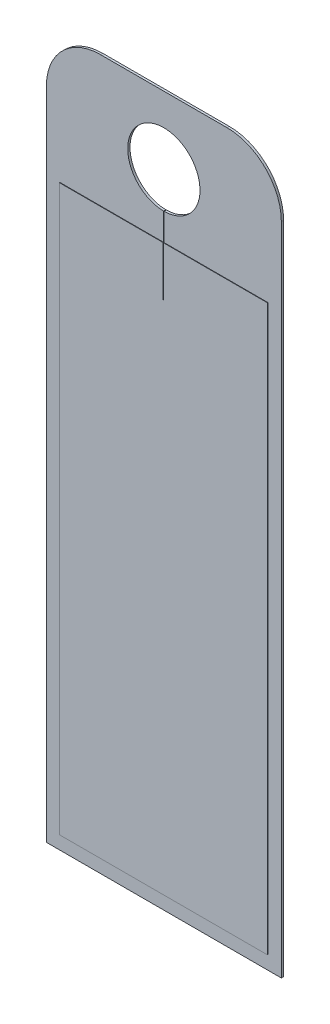
ISO-10303-21;
HEADER;
FILE_DESCRIPTION(('STEP AP214'),'2;1');
FILE_NAME('part.step','',(''),(''),'','','');
FILE_SCHEMA(('AUTOMOTIVE_DESIGN { 1 0 10303 214 1 1 1 1 }'));
ENDSEC;
DATA;
#1=APPLICATION_CONTEXT('core data for automotive mechanical design processes');
#2=APPLICATION_PROTOCOL_DEFINITION('international standard','automotive_design',2000,#1);
#3=PRODUCT_CONTEXT('',#1,'mechanical');
#4=PRODUCT('Part','Part','',(#3));
#5=PRODUCT_RELATED_PRODUCT_CATEGORY('part','',(#4));
#6=PRODUCT_DEFINITION_FORMATION('','',#4);
#7=PRODUCT_DEFINITION_CONTEXT('part definition',#1,'design');
#8=PRODUCT_DEFINITION('design','',#6,#7);
#9=PRODUCT_DEFINITION_SHAPE('','',#8);
#10=(LENGTH_UNIT() NAMED_UNIT(*) SI_UNIT(.MILLI.,.METRE.));
#11=(NAMED_UNIT(*) PLANE_ANGLE_UNIT() SI_UNIT($,.RADIAN.));
#12=(NAMED_UNIT(*) SI_UNIT($,.STERADIAN.) SOLID_ANGLE_UNIT());
#13=UNCERTAINTY_MEASURE_WITH_UNIT(LENGTH_MEASURE(1.E-05),#10,'distance_accuracy_value','');
#14=(GEOMETRIC_REPRESENTATION_CONTEXT(3) GLOBAL_UNCERTAINTY_ASSIGNED_CONTEXT((#13)) GLOBAL_UNIT_ASSIGNED_CONTEXT((#10,
#11,#12)) REPRESENTATION_CONTEXT('',''));
#15=CARTESIAN_POINT('',(0.,0.,0.));
#16=DIRECTION('',(0.,0.,1.));
#17=DIRECTION('',(1.,0.,0.));
#18=AXIS2_PLACEMENT_3D('',#15,#16,#17);
#19=CARTESIAN_POINT('',(-23.,-14.,-133.395345264014));
#20=DIRECTION('',(0.,1.,0.));
#21=DIRECTION('',(-1.,0.,0.));
#22=AXIS2_PLACEMENT_3D('',#19,#20,#21);
#23=PLANE('',#22);
#24=DIRECTION('',(0.,0.,1.));
#25=VECTOR('',#24,1.);
#26=CARTESIAN_POINT('',(-0.0500000000000014,-14.,-133.395345264014));
#27=LINE('',#26,#25);
#28=CARTESIAN_POINT('',(-0.0499999999999982,-14.,-0.099999999999989));
#29=VERTEX_POINT('',#28);
#30=CARTESIAN_POINT('',(-0.0499999999999976,-14.,0.));
#31=VERTEX_POINT('',#30);
#32=EDGE_CURVE('E267',#29,#31,#27,.T.);
#33=ORIENTED_EDGE('',*,*,#32,.F.);
#34=DIRECTION('',(1.,0.,0.));
#35=VECTOR('',#34,1.);
#36=CARTESIAN_POINT('',(-23.,-14.,-0.099999999999989));
#37=LINE('',#36,#35);
#38=CARTESIAN_POINT('',(-23.,-14.,-0.099999999999989));
#39=VERTEX_POINT('',#38);
#40=EDGE_CURVE('E290',#39,#29,#37,.T.);
#41=ORIENTED_EDGE('',*,*,#40,.F.);
#42=DIRECTION('',(0.,0.,1.));
#43=VECTOR('',#42,1.);
#44=CARTESIAN_POINT('',(-23.,-14.,-133.395345264014));
#45=LINE('',#44,#43);
#46=CARTESIAN_POINT('',(-23.,-14.,0.));
#47=VERTEX_POINT('',#46);
#48=EDGE_CURVE('E289',#39,#47,#45,.T.);
#49=ORIENTED_EDGE('',*,*,#48,.T.);
#50=DIRECTION('',(-1.,0.,0.));
#51=VECTOR('',#50,1.);
#52=CARTESIAN_POINT('',(-14.,-14.,0.));
#53=LINE('',#52,#51);
#54=EDGE_CURVE('E411',#31,#47,#53,.T.);
#55=ORIENTED_EDGE('',*,*,#54,.F.);
#56=EDGE_LOOP('',(#33,#41,#49,#55));
#57=FACE_BOUND('',#56,.T.);
#58=ADVANCED_FACE('F51',(#57),#23,.T.);
#59=DIRECTION('',(0.,0.,1.));
#60=VECTOR('',#59,1.);
#61=CARTESIAN_POINT('',(-0.0500000000000014,-14.,-133.395345264014));
#62=LINE('',#61,#60);
#63=CARTESIAN_POINT('',(-0.0500000000000014,-14.,0.5));
#64=VERTEX_POINT('',#63);
#65=CARTESIAN_POINT('',(-0.0499999999999982,-14.,0.6));
#66=VERTEX_POINT('',#65);
#67=EDGE_CURVE('E254',#64,#66,#62,.T.);
#68=ORIENTED_EDGE('',*,*,#67,.F.);
#69=DIRECTION('',(-1.,0.,0.));
#70=VECTOR('',#69,1.);
#71=CARTESIAN_POINT('',(-14.,-14.,0.5));
#72=LINE('',#71,#70);
#73=CARTESIAN_POINT('',(-23.,-14.,0.5));
#74=VERTEX_POINT('',#73);
#75=EDGE_CURVE('E74',#64,#74,#72,.T.);
#76=ORIENTED_EDGE('',*,*,#75,.T.);
#77=CARTESIAN_POINT('',(-23.,-14.,0.6));
#78=VERTEX_POINT('',#77);
#79=EDGE_CURVE('E301',#74,#78,#45,.T.);
#80=ORIENTED_EDGE('',*,*,#79,.T.);
#81=DIRECTION('',(-1.,0.,0.));
#82=VECTOR('',#81,1.);
#83=CARTESIAN_POINT('',(-23.,-14.,0.6));
#84=LINE('',#83,#82);
#85=EDGE_CURVE('E281',#66,#78,#84,.T.);
#86=ORIENTED_EDGE('',*,*,#85,.F.);
#87=EDGE_LOOP('',(#68,#76,#80,#86));
#88=FACE_BOUND('',#87,.T.);
#89=ADVANCED_FACE('F455',(#88),#23,.T.);
#90=CARTESIAN_POINT('',(-14.,3.,0.5));
#91=DIRECTION('',(0.,0.,1.));
#92=DIRECTION('',(1.,0.,0.));
#93=AXIS2_PLACEMENT_3D('',#90,#91,#92);
#94=PLANE('',#93);
#95=DIRECTION('',(0.,-1.,0.));
#96=VECTOR('',#95,1.);
#97=CARTESIAN_POINT('',(-0.0499999999999997,3.,0.5));
#98=LINE('',#97,#96);
#99=CARTESIAN_POINT('',(-0.0499999999999984,-7.99984374847409,0.5));
#100=VERTEX_POINT('',#99);
#101=EDGE_CURVE('E257',#100,#64,#98,.T.);
#102=ORIENTED_EDGE('',*,*,#101,.F.);
#103=CARTESIAN_POINT('',(0.,0.,0.5));
#104=DIRECTION('',(0.,0.,1.));
#105=DIRECTION('',(1.,0.,0.));
#106=AXIS2_PLACEMENT_3D('',#103,#104,#105);
#107=CIRCLE('',#106,8.);
#108=CARTESIAN_POINT('',(0.050000000000001,-7.99984374847409,0.5));
#109=VERTEX_POINT('',#108);
#110=EDGE_CURVE('E334',#109,#100,#107,.T.);
#111=ORIENTED_EDGE('',*,*,#110,.F.);
#112=DIRECTION('',(0.,1.,0.));
#113=VECTOR('',#112,1.);
#114=CARTESIAN_POINT('',(0.0499999999999997,3.,0.5));
#115=LINE('',#114,#113);
#116=CARTESIAN_POINT('',(0.0500000000000014,-14.,0.5));
#117=VERTEX_POINT('',#116);
#118=EDGE_CURVE('E241',#117,#109,#115,.T.);
#119=ORIENTED_EDGE('',*,*,#118,.F.);
#120=CARTESIAN_POINT('',(23.,-14.,0.5));
#121=VERTEX_POINT('',#120);
#122=EDGE_CURVE('E325',#121,#117,#72,.T.);
#123=ORIENTED_EDGE('',*,*,#122,.F.);
#124=DIRECTION('',(0.,1.,0.));
#125=VECTOR('',#124,1.);
#126=CARTESIAN_POINT('',(23.,3.,0.5));
#127=LINE('',#126,#125);
#128=CARTESIAN_POINT('',(23.,-139.,0.5));
#129=VERTEX_POINT('',#128);
#130=EDGE_CURVE('E321',#129,#121,#127,.T.);
#131=ORIENTED_EDGE('',*,*,#130,.F.);
#132=DIRECTION('',(1.,0.,0.));
#133=VECTOR('',#132,1.);
#134=CARTESIAN_POINT('',(-14.,-139.,0.5));
#135=LINE('',#134,#133);
#136=CARTESIAN_POINT('',(-23.,-139.,0.5));
#137=VERTEX_POINT('',#136);
#138=EDGE_CURVE('E317',#137,#129,#135,.T.);
#139=ORIENTED_EDGE('',*,*,#138,.F.);
#140=DIRECTION('',(0.,-1.,0.));
#141=VECTOR('',#140,1.);
#142=CARTESIAN_POINT('',(-23.,3.,0.5));
#143=LINE('',#142,#141);
#144=EDGE_CURVE('E329',#74,#137,#143,.T.);
#145=ORIENTED_EDGE('',*,*,#144,.F.);
#146=ORIENTED_EDGE('',*,*,#75,.F.);
#147=EDGE_LOOP('',(#102,#111,#119,#123,#131,#139,#145,#146));
#148=FACE_BOUND('',#147,.T.);
#149=DIRECTION('',(0.,1.,0.));
#150=VECTOR('',#149,1.);
#151=CARTESIAN_POINT('',(26.,2.99999999999992,0.5));
#152=LINE('',#151,#150);
#153=CARTESIAN_POINT('',(26.,-142.,0.5));
#154=VERTEX_POINT('',#153);
#155=CARTESIAN_POINT('',(26.,2.99999999999993,0.5));
#156=VERTEX_POINT('',#155);
#157=EDGE_CURVE('E342',#154,#156,#152,.T.);
#158=ORIENTED_EDGE('',*,*,#157,.T.);
#159=CARTESIAN_POINT('',(14.,3.00000000000001,0.5));
#160=DIRECTION('',(0.,0.,1.));
#161=DIRECTION('',(-1.,0.,0.));
#162=AXIS2_PLACEMENT_3D('',#159,#160,#161);
#163=CIRCLE('',#162,12.);
#164=CARTESIAN_POINT('',(13.9999999999999,15.,0.5));
#165=VERTEX_POINT('',#164);
#166=EDGE_CURVE('E346',#156,#165,#163,.T.);
#167=ORIENTED_EDGE('',*,*,#166,.T.);
#168=DIRECTION('',(-1.,0.,0.));
#169=VECTOR('',#168,1.);
#170=CARTESIAN_POINT('',(-13.9999999999999,15.,0.5));
#171=LINE('',#170,#169);
#172=CARTESIAN_POINT('',(-13.9999999999999,15.,0.5));
#173=VERTEX_POINT('',#172);
#174=EDGE_CURVE('E350',#165,#173,#171,.T.);
#175=ORIENTED_EDGE('',*,*,#174,.T.);
#176=CARTESIAN_POINT('',(-14.,3.,0.5));
#177=DIRECTION('',(0.,0.,1.));
#178=DIRECTION('',(1.,0.,0.));
#179=AXIS2_PLACEMENT_3D('',#176,#177,#178);
#180=CIRCLE('',#179,12.);
#181=CARTESIAN_POINT('',(-26.,2.99999999999991,0.5));
#182=VERTEX_POINT('',#181);
#183=EDGE_CURVE('E353',#173,#182,#180,.T.);
#184=ORIENTED_EDGE('',*,*,#183,.T.);
#185=DIRECTION('',(0.,-1.,0.));
#186=VECTOR('',#185,1.);
#187=CARTESIAN_POINT('',(-26.,2.99999999999991,0.5));
#188=LINE('',#187,#186);
#189=CARTESIAN_POINT('',(-26.,-142.,0.5));
#190=VERTEX_POINT('',#189);
#191=EDGE_CURVE('E356',#182,#190,#188,.T.);
#192=ORIENTED_EDGE('',*,*,#191,.T.);
#193=DIRECTION('',(1.,0.,0.));
#194=VECTOR('',#193,1.);
#195=CARTESIAN_POINT('',(-26.,-142.,0.5));
#196=LINE('',#195,#194);
#197=EDGE_CURVE('E359',#190,#154,#196,.T.);
#198=ORIENTED_EDGE('',*,*,#197,.T.);
#199=EDGE_LOOP('',(#158,#167,#175,#184,#192,#198));
#200=FACE_BOUND('',#199,.T.);
#201=ADVANCED_FACE('F474',(#148,#200),#94,.T.);
#202=CARTESIAN_POINT('',(-14.,3.,0.));
#203=DIRECTION('',(0.,0.,1.));
#204=DIRECTION('',(1.,0.,0.));
#205=AXIS2_PLACEMENT_3D('',#202,#203,#204);
#206=PLANE('',#205);
#207=CARTESIAN_POINT('',(0.,0.,0.));
#208=DIRECTION('',(0.,0.,1.));
#209=DIRECTION('',(1.,0.,0.));
#210=AXIS2_PLACEMENT_3D('',#207,#208,#209);
#211=CIRCLE('',#210,8.);
#212=CARTESIAN_POINT('',(0.0500000000000009,-7.99984374847409,0.));
#213=VERTEX_POINT('',#212);
#214=CARTESIAN_POINT('',(-0.0499999999999989,-7.99984374847409,0.));
#215=VERTEX_POINT('',#214);
#216=EDGE_CURVE('E333',#213,#215,#211,.T.);
#217=ORIENTED_EDGE('',*,*,#216,.T.);
#218=DIRECTION('',(0.,-1.,0.));
#219=VECTOR('',#218,1.);
#220=CARTESIAN_POINT('',(-0.0499999999999997,3.,0.));
#221=LINE('',#220,#219);
#222=EDGE_CURVE('E263',#215,#31,#221,.T.);
#223=ORIENTED_EDGE('',*,*,#222,.T.);
#224=ORIENTED_EDGE('',*,*,#54,.T.);
#225=DIRECTION('',(0.,-1.,0.));
#226=VECTOR('',#225,1.);
#227=CARTESIAN_POINT('',(-23.,3.,0.));
#228=LINE('',#227,#226);
#229=CARTESIAN_POINT('',(-23.,-139.,0.));
#230=VERTEX_POINT('',#229);
#231=EDGE_CURVE('E60',#47,#230,#228,.T.);
#232=ORIENTED_EDGE('',*,*,#231,.T.);
#233=DIRECTION('',(1.,0.,0.));
#234=VECTOR('',#233,1.);
#235=CARTESIAN_POINT('',(-14.,-139.,0.));
#236=LINE('',#235,#234);
#237=CARTESIAN_POINT('',(23.,-139.,0.));
#238=VERTEX_POINT('',#237);
#239=EDGE_CURVE('E403',#230,#238,#236,.T.);
#240=ORIENTED_EDGE('',*,*,#239,.T.);
#241=DIRECTION('',(0.,1.,0.));
#242=VECTOR('',#241,1.);
#243=CARTESIAN_POINT('',(23.,3.,0.));
#244=LINE('',#243,#242);
#245=CARTESIAN_POINT('',(23.,-14.,0.));
#246=VERTEX_POINT('',#245);
#247=EDGE_CURVE('E407',#238,#246,#244,.T.);
#248=ORIENTED_EDGE('',*,*,#247,.T.);
#249=CARTESIAN_POINT('',(0.0500000000000018,-14.,0.));
#250=VERTEX_POINT('',#249);
#251=EDGE_CURVE('E412',#246,#250,#53,.T.);
#252=ORIENTED_EDGE('',*,*,#251,.T.);
#253=DIRECTION('',(0.,1.,0.));
#254=VECTOR('',#253,1.);
#255=CARTESIAN_POINT('',(0.0499999999999997,3.,0.));
#256=LINE('',#255,#254);
#257=EDGE_CURVE('E247',#250,#213,#256,.T.);
#258=ORIENTED_EDGE('',*,*,#257,.T.);
#259=EDGE_LOOP('',(#217,#223,#224,#232,#240,#248,#252,#258));
#260=FACE_BOUND('',#259,.T.);
#261=DIRECTION('',(0.,1.,0.));
#262=VECTOR('',#261,1.);
#263=CARTESIAN_POINT('',(26.,2.99999999999992,0.));
#264=LINE('',#263,#262);
#265=CARTESIAN_POINT('',(26.,-142.,0.));
#266=VERTEX_POINT('',#265);
#267=CARTESIAN_POINT('',(26.,2.99999999999993,0.));
#268=VERTEX_POINT('',#267);
#269=EDGE_CURVE('E338',#266,#268,#264,.T.);
#270=ORIENTED_EDGE('',*,*,#269,.F.);
#271=DIRECTION('',(1.,0.,0.));
#272=VECTOR('',#271,1.);
#273=CARTESIAN_POINT('',(-26.,-142.,0.));
#274=LINE('',#273,#272);
#275=CARTESIAN_POINT('',(-26.,-142.,0.));
#276=VERTEX_POINT('',#275);
#277=EDGE_CURVE('E347',#276,#266,#274,.T.);
#278=ORIENTED_EDGE('',*,*,#277,.F.);
#279=DIRECTION('',(0.,-1.,0.));
#280=VECTOR('',#279,1.);
#281=CARTESIAN_POINT('',(-26.,2.99999999999991,0.));
#282=LINE('',#281,#280);
#283=CARTESIAN_POINT('',(-26.,2.99999999999991,0.));
#284=VERTEX_POINT('',#283);
#285=EDGE_CURVE('E375',#284,#276,#282,.T.);
#286=ORIENTED_EDGE('',*,*,#285,.F.);
#287=CARTESIAN_POINT('',(-14.,3.,0.));
#288=DIRECTION('',(0.,0.,1.));
#289=DIRECTION('',(1.,0.,0.));
#290=AXIS2_PLACEMENT_3D('',#287,#288,#289);
#291=CIRCLE('',#290,12.);
#292=CARTESIAN_POINT('',(-13.9999999999999,15.,0.));
#293=VERTEX_POINT('',#292);
#294=EDGE_CURVE('E372',#293,#284,#291,.T.);
#295=ORIENTED_EDGE('',*,*,#294,.F.);
#296=DIRECTION('',(-1.,0.,0.));
#297=VECTOR('',#296,1.);
#298=CARTESIAN_POINT('',(-13.9999999999999,15.,0.));
#299=LINE('',#298,#297);
#300=CARTESIAN_POINT('',(13.9999999999999,15.,0.));
#301=VERTEX_POINT('',#300);
#302=EDGE_CURVE('E369',#301,#293,#299,.T.);
#303=ORIENTED_EDGE('',*,*,#302,.F.);
#304=CARTESIAN_POINT('',(14.,3.00000000000001,0.));
#305=DIRECTION('',(0.,0.,1.));
#306=DIRECTION('',(-1.,0.,0.));
#307=AXIS2_PLACEMENT_3D('',#304,#305,#306);
#308=CIRCLE('',#307,12.);
#309=EDGE_CURVE('E366',#268,#301,#308,.T.);
#310=ORIENTED_EDGE('',*,*,#309,.F.);
#311=EDGE_LOOP('',(#270,#278,#286,#295,#303,#310));
#312=FACE_BOUND('',#311,.T.);
#313=ADVANCED_FACE('F419',(#260,#312),#206,.F.);
#314=CARTESIAN_POINT('',(26.,2.99999999999992,0.5));
#315=DIRECTION('',(-1.,0.,0.));
#316=DIRECTION('',(0.,-1.,0.));
#317=AXIS2_PLACEMENT_3D('',#314,#315,#316);
#318=PLANE('',#317);
#319=ORIENTED_EDGE('',*,*,#269,.T.);
#320=DIRECTION('',(0.,0.,-1.));
#321=VECTOR('',#320,1.);
#322=CARTESIAN_POINT('',(26.,2.99999999999993,0.5));
#323=LINE('',#322,#321);
#324=EDGE_CURVE('E399',#156,#268,#323,.T.);
#325=ORIENTED_EDGE('',*,*,#324,.F.);
#326=ORIENTED_EDGE('',*,*,#157,.F.);
#327=DIRECTION('',(0.,0.,-1.));
#328=VECTOR('',#327,1.);
#329=CARTESIAN_POINT('',(26.,-142.,0.5));
#330=LINE('',#329,#328);
#331=EDGE_CURVE('E362',#154,#266,#330,.T.);
#332=ORIENTED_EDGE('',*,*,#331,.T.);
#333=EDGE_LOOP('',(#319,#325,#326,#332));
#334=FACE_BOUND('',#333,.T.);
#335=ADVANCED_FACE('F53',(#334),#318,.F.);
#336=CARTESIAN_POINT('',(14.,3.00000000000001,0.5));
#337=DIRECTION('',(0.,0.,-1.));
#338=DIRECTION('',(-1.,0.,0.));
#339=AXIS2_PLACEMENT_3D('',#336,#337,#338);
#340=CYLINDRICAL_SURFACE('',#339,12.);
#341=ORIENTED_EDGE('',*,*,#309,.T.);
#342=DIRECTION('',(0.,0.,-1.));
#343=VECTOR('',#342,1.);
#344=CARTESIAN_POINT('',(13.9999999999999,15.,0.5));
#345=LINE('',#344,#343);
#346=EDGE_CURVE('E395',#165,#301,#345,.T.);
#347=ORIENTED_EDGE('',*,*,#346,.F.);
#348=ORIENTED_EDGE('',*,*,#166,.F.);
#349=ORIENTED_EDGE('',*,*,#324,.T.);
#350=EDGE_LOOP('',(#341,#347,#348,#349));
#351=FACE_BOUND('',#350,.T.);
#352=ADVANCED_FACE('F538',(#351),#340,.T.);
#353=CARTESIAN_POINT('',(-13.9999999999999,15.,0.5));
#354=DIRECTION('',(0.,-1.,0.));
#355=DIRECTION('',(1.,0.,0.));
#356=AXIS2_PLACEMENT_3D('',#353,#354,#355);
#357=PLANE('',#356);
#358=ORIENTED_EDGE('',*,*,#302,.T.);
#359=DIRECTION('',(0.,0.,-1.));
#360=VECTOR('',#359,1.);
#361=CARTESIAN_POINT('',(-13.9999999999999,15.,0.5));
#362=LINE('',#361,#360);
#363=EDGE_CURVE('E391',#173,#293,#362,.T.);
#364=ORIENTED_EDGE('',*,*,#363,.F.);
#365=ORIENTED_EDGE('',*,*,#174,.F.);
#366=ORIENTED_EDGE('',*,*,#346,.T.);
#367=EDGE_LOOP('',(#358,#364,#365,#366));
#368=FACE_BOUND('',#367,.T.);
#369=ADVANCED_FACE('F535',(#368),#357,.F.);
#370=CARTESIAN_POINT('',(-14.,3.,0.5));
#371=DIRECTION('',(0.,0.,-1.));
#372=DIRECTION('',(-1.,0.,0.));
#373=AXIS2_PLACEMENT_3D('',#370,#371,#372);
#374=CYLINDRICAL_SURFACE('',#373,12.);
#375=ORIENTED_EDGE('',*,*,#294,.T.);
#376=DIRECTION('',(0.,0.,-1.));
#377=VECTOR('',#376,1.);
#378=CARTESIAN_POINT('',(-26.,2.99999999999991,0.5));
#379=LINE('',#378,#377);
#380=EDGE_CURVE('E387',#182,#284,#379,.T.);
#381=ORIENTED_EDGE('',*,*,#380,.F.);
#382=ORIENTED_EDGE('',*,*,#183,.F.);
#383=ORIENTED_EDGE('',*,*,#363,.T.);
#384=EDGE_LOOP('',(#375,#381,#382,#383));
#385=FACE_BOUND('',#384,.T.);
#386=ADVANCED_FACE('F531',(#385),#374,.T.);
#387=CARTESIAN_POINT('',(-26.,2.99999999999991,0.5));
#388=DIRECTION('',(1.,0.,0.));
#389=DIRECTION('',(0.,1.,0.));
#390=AXIS2_PLACEMENT_3D('',#387,#388,#389);
#391=PLANE('',#390);
#392=ORIENTED_EDGE('',*,*,#285,.T.);
#393=DIRECTION('',(0.,0.,-1.));
#394=VECTOR('',#393,1.);
#395=CARTESIAN_POINT('',(-26.,-142.,0.5));
#396=LINE('',#395,#394);
#397=EDGE_CURVE('E383',#190,#276,#396,.T.);
#398=ORIENTED_EDGE('',*,*,#397,.F.);
#399=ORIENTED_EDGE('',*,*,#191,.F.);
#400=ORIENTED_EDGE('',*,*,#380,.T.);
#401=EDGE_LOOP('',(#392,#398,#399,#400));
#402=FACE_BOUND('',#401,.T.);
#403=ADVANCED_FACE('F527',(#402),#391,.F.);
#404=CARTESIAN_POINT('',(-26.,-142.,0.5));
#405=DIRECTION('',(0.,1.,0.));
#406=DIRECTION('',(0.,0.,1.));
#407=AXIS2_PLACEMENT_3D('',#404,#405,#406);
#408=PLANE('',#407);
#409=ORIENTED_EDGE('',*,*,#277,.T.);
#410=ORIENTED_EDGE('',*,*,#331,.F.);
#411=ORIENTED_EDGE('',*,*,#197,.F.);
#412=ORIENTED_EDGE('',*,*,#397,.T.);
#413=EDGE_LOOP('',(#409,#410,#411,#412));
#414=FACE_BOUND('',#413,.T.);
#415=ADVANCED_FACE('F520',(#414),#408,.F.);
#416=CARTESIAN_POINT('',(0.,0.,0.5));
#417=DIRECTION('',(0.,0.,-1.));
#418=DIRECTION('',(-1.,0.,0.));
#419=AXIS2_PLACEMENT_3D('',#416,#417,#418);
#420=CYLINDRICAL_SURFACE('',#419,8.);
#421=DIRECTION('',(0.,0.,-1.));
#422=VECTOR('',#421,1.);
#423=CARTESIAN_POINT('',(-0.0499999999999989,-7.99984374847409,0.5));
#424=LINE('',#423,#422);
#425=EDGE_CURVE('E260',#215,#100,#424,.F.);
#426=ORIENTED_EDGE('',*,*,#425,.F.);
#427=ORIENTED_EDGE('',*,*,#216,.F.);
#428=DIRECTION('',(0.,0.,-1.));
#429=VECTOR('',#428,1.);
#430=CARTESIAN_POINT('',(0.0500000000000009,-7.99984374847409,0.5));
#431=LINE('',#430,#429);
#432=EDGE_CURVE('E244',#109,#213,#431,.T.);
#433=ORIENTED_EDGE('',*,*,#432,.F.);
#434=ORIENTED_EDGE('',*,*,#110,.T.);
#435=EDGE_LOOP('',(#426,#427,#433,#434));
#436=FACE_BOUND('',#435,.T.);
#437=ADVANCED_FACE('F478',(#436),#420,.F.);
#438=CARTESIAN_POINT('',(-14.,3.,-0.1));
#439=DIRECTION('',(0.,0.,1.));
#440=DIRECTION('',(1.,0.,0.));
#441=AXIS2_PLACEMENT_3D('',#438,#439,#440);
#442=PLANE('',#441);
#443=ORIENTED_EDGE('',*,*,#40,.T.);
#444=DIRECTION('',(0.,-1.,0.));
#445=VECTOR('',#444,1.);
#446=CARTESIAN_POINT('',(-0.0499999999999999,0.,-0.099999999999989));
#447=LINE('',#446,#445);
#448=CARTESIAN_POINT('',(-0.0499999999999969,-25.,-0.099999999999989));
#449=VERTEX_POINT('',#448);
#450=EDGE_CURVE('E226',#29,#449,#447,.T.);
#451=ORIENTED_EDGE('',*,*,#450,.T.);
#452=DIRECTION('',(1.,0.,0.));
#453=VECTOR('',#452,1.);
#454=CARTESIAN_POINT('',(-0.0499999999999969,-25.,-0.099999999999989));
#455=LINE('',#454,#453);
#456=CARTESIAN_POINT('',(0.050000000000003,-25.,-0.099999999999989));
#457=VERTEX_POINT('',#456);
#458=EDGE_CURVE('E230',#449,#457,#455,.T.);
#459=ORIENTED_EDGE('',*,*,#458,.T.);
#460=DIRECTION('',(0.,1.,0.));
#461=VECTOR('',#460,1.);
#462=CARTESIAN_POINT('',(0.0499999999999999,0.,-0.099999999999989));
#463=LINE('',#462,#461);
#464=CARTESIAN_POINT('',(0.0500000000000016,-14.,-0.099999999999989));
#465=VERTEX_POINT('',#464);
#466=EDGE_CURVE('E208',#457,#465,#463,.T.);
#467=ORIENTED_EDGE('',*,*,#466,.T.);
#468=CARTESIAN_POINT('',(23.,-14.,-0.099999999999989));
#469=VERTEX_POINT('',#468);
#470=EDGE_CURVE('E288',#465,#469,#37,.T.);
#471=ORIENTED_EDGE('',*,*,#470,.T.);
#472=DIRECTION('',(0.,-1.,0.));
#473=VECTOR('',#472,1.);
#474=CARTESIAN_POINT('',(23.,-14.,-0.099999999999989));
#475=LINE('',#474,#473);
#476=CARTESIAN_POINT('',(23.,-139.,-0.099999999999989));
#477=VERTEX_POINT('',#476);
#478=EDGE_CURVE('E285',#469,#477,#475,.T.);
#479=ORIENTED_EDGE('',*,*,#478,.T.);
#480=DIRECTION('',(-1.,0.,0.));
#481=VECTOR('',#480,1.);
#482=CARTESIAN_POINT('',(-23.,-139.,-0.099999999999989));
#483=LINE('',#482,#481);
#484=CARTESIAN_POINT('',(-23.,-139.,-0.099999999999989));
#485=VERTEX_POINT('',#484);
#486=EDGE_CURVE('E297',#477,#485,#483,.T.);
#487=ORIENTED_EDGE('',*,*,#486,.T.);
#488=DIRECTION('',(0.,1.,0.));
#489=VECTOR('',#488,1.);
#490=CARTESIAN_POINT('',(-23.,-14.,-0.099999999999989));
#491=LINE('',#490,#489);
#492=EDGE_CURVE('E294',#485,#39,#491,.T.);
#493=ORIENTED_EDGE('',*,*,#492,.T.);
#494=EDGE_LOOP('',(#443,#451,#459,#467,#471,#479,#487,#493));
#495=FACE_BOUND('',#494,.T.);
#496=ADVANCED_FACE('F431',(#495),#442,.F.);
#497=CARTESIAN_POINT('',(-23.,-139.,-133.395345264014));
#498=DIRECTION('',(0.,-1.,0.));
#499=DIRECTION('',(0.,0.,-1.));
#500=AXIS2_PLACEMENT_3D('',#497,#498,#499);
#501=PLANE('',#500);
#502=ORIENTED_EDGE('',*,*,#239,.F.);
#503=DIRECTION('',(0.,0.,1.));
#504=VECTOR('',#503,1.);
#505=CARTESIAN_POINT('',(-23.,-139.,-133.395345264014));
#506=LINE('',#505,#504);
#507=EDGE_CURVE('E311',#485,#230,#506,.T.);
#508=ORIENTED_EDGE('',*,*,#507,.F.);
#509=ORIENTED_EDGE('',*,*,#486,.F.);
#510=DIRECTION('',(0.,0.,1.));
#511=VECTOR('',#510,1.);
#512=CARTESIAN_POINT('',(23.,-139.,-133.395345264014));
#513=LINE('',#512,#511);
#514=EDGE_CURVE('E307',#477,#238,#513,.T.);
#515=ORIENTED_EDGE('',*,*,#514,.T.);
#516=EDGE_LOOP('',(#502,#508,#509,#515));
#517=FACE_BOUND('',#516,.T.);
#518=ADVANCED_FACE('F434',(#517),#501,.T.);
#519=CARTESIAN_POINT('',(23.,-14.,-133.395345264014));
#520=DIRECTION('',(1.,0.,0.));
#521=DIRECTION('',(0.,1.,0.));
#522=AXIS2_PLACEMENT_3D('',#519,#520,#521);
#523=PLANE('',#522);
#524=ORIENTED_EDGE('',*,*,#247,.F.);
#525=ORIENTED_EDGE('',*,*,#514,.F.);
#526=ORIENTED_EDGE('',*,*,#478,.F.);
#527=DIRECTION('',(0.,0.,1.));
#528=VECTOR('',#527,1.);
#529=CARTESIAN_POINT('',(23.,-14.,-133.395345264014));
#530=LINE('',#529,#528);
#531=EDGE_CURVE('E302',#469,#246,#530,.T.);
#532=ORIENTED_EDGE('',*,*,#531,.T.);
#533=EDGE_LOOP('',(#524,#525,#526,#532));
#534=FACE_BOUND('',#533,.T.);
#535=ADVANCED_FACE('F439',(#534),#523,.T.);
#536=DIRECTION('',(0.,0.,-1.));
#537=VECTOR('',#536,1.);
#538=CARTESIAN_POINT('',(0.0500000000000014,-14.,-133.395345264014));
#539=LINE('',#538,#537);
#540=EDGE_CURVE('E251',#250,#465,#539,.T.);
#541=ORIENTED_EDGE('',*,*,#540,.F.);
#542=ORIENTED_EDGE('',*,*,#251,.F.);
#543=ORIENTED_EDGE('',*,*,#531,.F.);
#544=ORIENTED_EDGE('',*,*,#470,.F.);
#545=EDGE_LOOP('',(#541,#542,#543,#544));
#546=FACE_BOUND('',#545,.T.);
#547=ADVANCED_FACE('F444',(#546),#23,.T.);
#548=CARTESIAN_POINT('',(-23.,-14.,-133.395345264014));
#549=DIRECTION('',(-1.,0.,0.));
#550=DIRECTION('',(0.,-1.,0.));
#551=AXIS2_PLACEMENT_3D('',#548,#549,#550);
#552=PLANE('',#551);
#553=ORIENTED_EDGE('',*,*,#231,.F.);
#554=ORIENTED_EDGE('',*,*,#48,.F.);
#555=ORIENTED_EDGE('',*,*,#492,.F.);
#556=ORIENTED_EDGE('',*,*,#507,.T.);
#557=EDGE_LOOP('',(#553,#554,#555,#556));
#558=FACE_BOUND('',#557,.T.);
#559=ADVANCED_FACE('F424',(#558),#552,.T.);
#560=ORIENTED_EDGE('',*,*,#79,.F.);
#561=ORIENTED_EDGE('',*,*,#144,.T.);
#562=CARTESIAN_POINT('',(-23.,-139.,0.6));
#563=VERTEX_POINT('',#562);
#564=EDGE_CURVE('E284',#137,#563,#506,.T.);
#565=ORIENTED_EDGE('',*,*,#564,.T.);
#566=DIRECTION('',(0.,-1.,0.));
#567=VECTOR('',#566,1.);
#568=CARTESIAN_POINT('',(-23.,-14.,0.6));
#569=LINE('',#568,#567);
#570=EDGE_CURVE('E270',#78,#563,#569,.T.);
#571=ORIENTED_EDGE('',*,*,#570,.F.);
#572=EDGE_LOOP('',(#560,#561,#565,#571));
#573=FACE_BOUND('',#572,.T.);
#574=ADVANCED_FACE('F457',(#573),#552,.T.);
#575=DIRECTION('',(0.,0.,-1.));
#576=VECTOR('',#575,1.);
#577=CARTESIAN_POINT('',(0.0500000000000014,-14.,-133.395345264014));
#578=LINE('',#577,#576);
#579=CARTESIAN_POINT('',(0.0500000000000016,-14.,0.6));
#580=VERTEX_POINT('',#579);
#581=EDGE_CURVE('E211',#580,#117,#578,.T.);
#582=ORIENTED_EDGE('',*,*,#581,.F.);
#583=CARTESIAN_POINT('',(23.,-14.,0.6));
#584=VERTEX_POINT('',#583);
#585=EDGE_CURVE('E224',#584,#580,#84,.T.);
#586=ORIENTED_EDGE('',*,*,#585,.F.);
#587=EDGE_CURVE('E306',#121,#584,#530,.T.);
#588=ORIENTED_EDGE('',*,*,#587,.F.);
#589=ORIENTED_EDGE('',*,*,#122,.T.);
#590=EDGE_LOOP('',(#582,#586,#588,#589));
#591=FACE_BOUND('',#590,.T.);
#592=ADVANCED_FACE('F468',(#591),#23,.T.);
#593=CARTESIAN_POINT('',(23.,-139.,0.6));
#594=VERTEX_POINT('',#593);
#595=EDGE_CURVE('E310',#129,#594,#513,.T.);
#596=ORIENTED_EDGE('',*,*,#595,.F.);
#597=ORIENTED_EDGE('',*,*,#130,.T.);
#598=ORIENTED_EDGE('',*,*,#587,.T.);
#599=DIRECTION('',(0.,1.,0.));
#600=VECTOR('',#599,1.);
#601=CARTESIAN_POINT('',(23.,-14.,0.6));
#602=LINE('',#601,#600);
#603=EDGE_CURVE('E278',#594,#584,#602,.T.);
#604=ORIENTED_EDGE('',*,*,#603,.F.);
#605=EDGE_LOOP('',(#596,#597,#598,#604));
#606=FACE_BOUND('',#605,.T.);
#607=ADVANCED_FACE('F465',(#606),#523,.T.);
#608=ORIENTED_EDGE('',*,*,#564,.F.);
#609=ORIENTED_EDGE('',*,*,#138,.T.);
#610=ORIENTED_EDGE('',*,*,#595,.T.);
#611=DIRECTION('',(1.,0.,0.));
#612=VECTOR('',#611,1.);
#613=CARTESIAN_POINT('',(-23.,-139.,0.6));
#614=LINE('',#613,#612);
#615=EDGE_CURVE('E274',#563,#594,#614,.T.);
#616=ORIENTED_EDGE('',*,*,#615,.F.);
#617=EDGE_LOOP('',(#608,#609,#610,#616));
#618=FACE_BOUND('',#617,.T.);
#619=ADVANCED_FACE('F461',(#618),#501,.T.);
#620=CARTESIAN_POINT('',(0.,0.,0.6));
#621=DIRECTION('',(0.,0.,1.));
#622=DIRECTION('',(1.,0.,0.));
#623=AXIS2_PLACEMENT_3D('',#620,#621,#622);
#624=PLANE('',#623);
#625=DIRECTION('',(0.,-1.,0.));
#626=VECTOR('',#625,1.);
#627=CARTESIAN_POINT('',(-0.0499999999999999,0.,0.6));
#628=LINE('',#627,#626);
#629=CARTESIAN_POINT('',(-0.0499999999999969,-25.,0.6));
#630=VERTEX_POINT('',#629);
#631=EDGE_CURVE('E12',#66,#630,#628,.T.);
#632=ORIENTED_EDGE('',*,*,#631,.F.);
#633=ORIENTED_EDGE('',*,*,#85,.T.);
#634=ORIENTED_EDGE('',*,*,#570,.T.);
#635=ORIENTED_EDGE('',*,*,#615,.T.);
#636=ORIENTED_EDGE('',*,*,#603,.T.);
#637=ORIENTED_EDGE('',*,*,#585,.T.);
#638=DIRECTION('',(0.,1.,0.));
#639=VECTOR('',#638,1.);
#640=CARTESIAN_POINT('',(0.0499999999999999,0.,0.6));
#641=LINE('',#640,#639);
#642=CARTESIAN_POINT('',(0.050000000000003,-25.,0.6));
#643=VERTEX_POINT('',#642);
#644=EDGE_CURVE('E205',#643,#580,#641,.T.);
#645=ORIENTED_EDGE('',*,*,#644,.F.);
#646=DIRECTION('',(1.,0.,0.));
#647=VECTOR('',#646,1.);
#648=CARTESIAN_POINT('',(-0.0499999999999969,-25.,0.6));
#649=LINE('',#648,#647);
#650=EDGE_CURVE('E214',#630,#643,#649,.T.);
#651=ORIENTED_EDGE('',*,*,#650,.F.);
#652=EDGE_LOOP('',(#632,#633,#634,#635,#636,#637,#645,#651));
#653=FACE_BOUND('',#652,.T.);
#654=ADVANCED_FACE('F221',(#653),#624,.T.);
#655=CARTESIAN_POINT('',(-0.0499999999999999,0.,-0.099999999999989));
#656=DIRECTION('',(-1.,0.,0.));
#657=DIRECTION('',(0.,-1.,0.));
#658=AXIS2_PLACEMENT_3D('',#655,#656,#657);
#659=PLANE('',#658);
#660=ORIENTED_EDGE('',*,*,#32,.T.);
#661=ORIENTED_EDGE('',*,*,#222,.F.);
#662=ORIENTED_EDGE('',*,*,#425,.T.);
#663=ORIENTED_EDGE('',*,*,#101,.T.);
#664=ORIENTED_EDGE('',*,*,#67,.T.);
#665=ORIENTED_EDGE('',*,*,#631,.T.);
#666=DIRECTION('',(0.,0.,1.));
#667=VECTOR('',#666,1.);
#668=CARTESIAN_POINT('',(-0.0499999999999969,-25.,-0.099999999999989));
#669=LINE('',#668,#667);
#670=EDGE_CURVE('E67',#449,#630,#669,.T.);
#671=ORIENTED_EDGE('',*,*,#670,.F.);
#672=ORIENTED_EDGE('',*,*,#450,.F.);
#673=EDGE_LOOP('',(#660,#661,#662,#663,#664,#665,#671,#672));
#674=FACE_BOUND('',#673,.T.);
#675=ADVANCED_FACE('F480',(#674),#659,.F.);
#676=CARTESIAN_POINT('',(0.0499999999999999,0.,-0.099999999999989));
#677=DIRECTION('',(1.,0.,0.));
#678=DIRECTION('',(0.,1.,0.));
#679=AXIS2_PLACEMENT_3D('',#676,#677,#678);
#680=PLANE('',#679);
#681=ORIENTED_EDGE('',*,*,#540,.T.);
#682=ORIENTED_EDGE('',*,*,#466,.F.);
#683=DIRECTION('',(0.,0.,1.));
#684=VECTOR('',#683,1.);
#685=CARTESIAN_POINT('',(0.050000000000003,-25.,-0.099999999999989));
#686=LINE('',#685,#684);
#687=EDGE_CURVE('E202',#457,#643,#686,.T.);
#688=ORIENTED_EDGE('',*,*,#687,.T.);
#689=ORIENTED_EDGE('',*,*,#644,.T.);
#690=ORIENTED_EDGE('',*,*,#581,.T.);
#691=ORIENTED_EDGE('',*,*,#118,.T.);
#692=ORIENTED_EDGE('',*,*,#432,.T.);
#693=ORIENTED_EDGE('',*,*,#257,.F.);
#694=EDGE_LOOP('',(#681,#682,#688,#689,#690,#691,#692,#693));
#695=FACE_BOUND('',#694,.T.);
#696=ADVANCED_FACE('F203',(#695),#680,.F.);
#697=CARTESIAN_POINT('',(-0.0499999999999969,-25.,-0.099999999999989));
#698=DIRECTION('',(0.,-1.,0.));
#699=DIRECTION('',(0.,0.,-1.));
#700=AXIS2_PLACEMENT_3D('',#697,#698,#699);
#701=PLANE('',#700);
#702=ORIENTED_EDGE('',*,*,#687,.F.);
#703=ORIENTED_EDGE('',*,*,#458,.F.);
#704=ORIENTED_EDGE('',*,*,#670,.T.);
#705=ORIENTED_EDGE('',*,*,#650,.T.);
#706=EDGE_LOOP('',(#702,#703,#704,#705));
#707=FACE_BOUND('',#706,.T.);
#708=ADVANCED_FACE('F215',(#707),#701,.F.);
#709=CLOSED_SHELL('',(#58,#89,#201,#313,#335,#352,#369,#386,#403,#415,#437,#496,#518,#535,#547,
#559,#574,#592,#607,#619,#654,#675,#696,#708));
#710=MANIFOLD_SOLID_BREP('B2',#709);
#711=ADVANCED_BREP_SHAPE_REPRESENTATION('',(#18,#710),#14);
#712=SHAPE_DEFINITION_REPRESENTATION(#9,#711);
ENDSEC;
END-ISO-10303-21;
